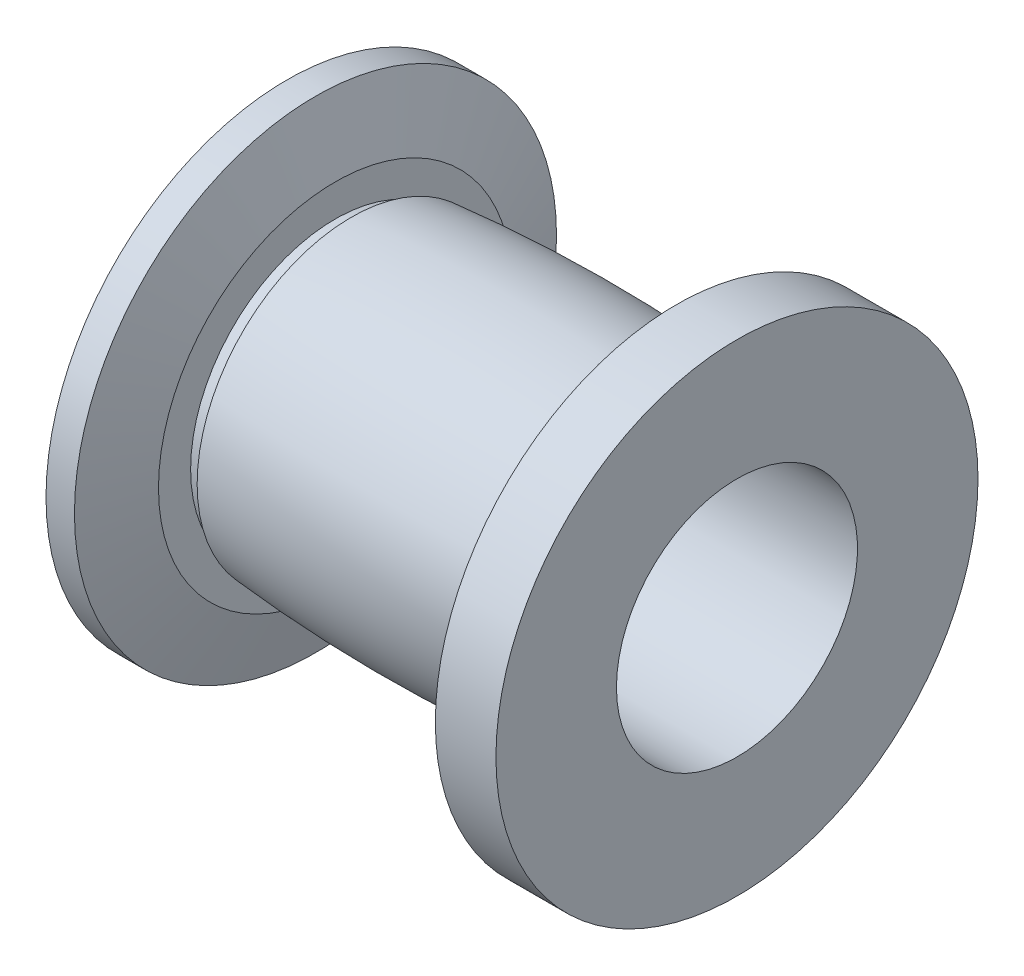
ISO-10303-21;
HEADER;
FILE_DESCRIPTION(('STEP AP214'),'2;1');
FILE_NAME('part.step','',(''),(''),'','','');
FILE_SCHEMA(('AUTOMOTIVE_DESIGN { 1 0 10303 214 1 1 1 1 }'));
ENDSEC;
DATA;
#1=APPLICATION_CONTEXT('core data for automotive mechanical design processes');
#2=APPLICATION_PROTOCOL_DEFINITION('international standard','automotive_design',2000,#1);
#3=PRODUCT_CONTEXT('',#1,'mechanical');
#4=PRODUCT('Part','Part','',(#3));
#5=PRODUCT_RELATED_PRODUCT_CATEGORY('part','',(#4));
#6=PRODUCT_DEFINITION_FORMATION('','',#4);
#7=PRODUCT_DEFINITION_CONTEXT('part definition',#1,'design');
#8=PRODUCT_DEFINITION('design','',#6,#7);
#9=PRODUCT_DEFINITION_SHAPE('','',#8);
#10=(LENGTH_UNIT() NAMED_UNIT(*) SI_UNIT(.MILLI.,.METRE.));
#11=(NAMED_UNIT(*) PLANE_ANGLE_UNIT() SI_UNIT($,.RADIAN.));
#12=(NAMED_UNIT(*) SI_UNIT($,.STERADIAN.) SOLID_ANGLE_UNIT());
#13=UNCERTAINTY_MEASURE_WITH_UNIT(LENGTH_MEASURE(1.E-05),#10,'distance_accuracy_value','');
#14=(GEOMETRIC_REPRESENTATION_CONTEXT(3) GLOBAL_UNCERTAINTY_ASSIGNED_CONTEXT((#13)) GLOBAL_UNIT_ASSIGNED_CONTEXT((#10,
#11,#12)) REPRESENTATION_CONTEXT('',''));
#15=CARTESIAN_POINT('',(0.,0.,0.));
#16=DIRECTION('',(0.,0.,1.));
#17=DIRECTION('',(1.,0.,0.));
#18=AXIS2_PLACEMENT_3D('',#15,#16,#17);
#19=CARTESIAN_POINT('',(28.,15.,0.));
#20=DIRECTION('',(-1.,0.,0.));
#21=DIRECTION('',(0.,0.,1.));
#22=AXIS2_PLACEMENT_3D('',#19,#20,#21);
#23=PLANE('',#22);
#24=CARTESIAN_POINT('',(28.,0.,0.));
#25=DIRECTION('',(-1.,0.,0.));
#26=DIRECTION('',(0.,0.,1.));
#27=AXIS2_PLACEMENT_3D('',#24,#25,#26);
#28=CIRCLE('',#27,15.);
#29=CARTESIAN_POINT('',(28.,0.,15.));
#30=VERTEX_POINT('',#29);
#31=EDGE_CURVE('E10',#30,#30,#28,.T.);
#32=ORIENTED_EDGE('',*,*,#31,.F.);
#33=EDGE_LOOP('',(#32));
#34=FACE_BOUND('',#33,.T.);
#35=CARTESIAN_POINT('',(28.,0.,0.));
#36=DIRECTION('',(-1.,0.,0.));
#37=DIRECTION('',(0.,0.,1.));
#38=AXIS2_PLACEMENT_3D('',#35,#36,#37);
#39=CIRCLE('',#38,7.5);
#40=CARTESIAN_POINT('',(28.,0.,7.5));
#41=VERTEX_POINT('',#40);
#42=EDGE_CURVE('E76',#41,#41,#39,.T.);
#43=ORIENTED_EDGE('',*,*,#42,.T.);
#44=EDGE_LOOP('',(#43));
#45=FACE_BOUND('',#44,.T.);
#46=ADVANCED_FACE('F30',(#34,#45),#23,.F.);
#47=CARTESIAN_POINT('',(0.,0.,0.));
#48=DIRECTION('',(1.,0.,0.));
#49=DIRECTION('',(0.,0.,-1.));
#50=AXIS2_PLACEMENT_3D('',#47,#48,#49);
#51=PLANE('',#50);
#52=CARTESIAN_POINT('',(0.,0.,0.));
#53=DIRECTION('',(-1.,0.,0.));
#54=DIRECTION('',(0.,0.,1.));
#55=AXIS2_PLACEMENT_3D('',#52,#53,#54);
#56=CIRCLE('',#55,15.);
#57=CARTESIAN_POINT('',(0.,0.,15.));
#58=VERTEX_POINT('',#57);
#59=EDGE_CURVE('E70',#58,#58,#56,.T.);
#60=ORIENTED_EDGE('',*,*,#59,.T.);
#61=EDGE_LOOP('',(#60));
#62=FACE_BOUND('',#61,.T.);
#63=CARTESIAN_POINT('',(0.,0.,0.));
#64=DIRECTION('',(-1.,0.,0.));
#65=DIRECTION('',(0.,0.,1.));
#66=AXIS2_PLACEMENT_3D('',#63,#64,#65);
#67=CIRCLE('',#66,7.5);
#68=CARTESIAN_POINT('',(0.,0.,7.5));
#69=VERTEX_POINT('',#68);
#70=EDGE_CURVE('E73',#69,#69,#67,.T.);
#71=ORIENTED_EDGE('',*,*,#70,.F.);
#72=EDGE_LOOP('',(#71));
#73=FACE_BOUND('',#72,.T.);
#74=ADVANCED_FACE('F94',(#62,#73),#51,.F.);
#75=CARTESIAN_POINT('',(-3.44380360226759,0.,0.));
#76=DIRECTION('',(-1.,0.,0.));
#77=DIRECTION('',(0.,0.,1.));
#78=AXIS2_PLACEMENT_3D('',#75,#76,#77);
#79=CYLINDRICAL_SURFACE('',#78,15.);
#80=CARTESIAN_POINT('',(24.23,0.,0.));
#81=DIRECTION('',(-1.,0.,0.));
#82=DIRECTION('',(0.,0.,1.));
#83=AXIS2_PLACEMENT_3D('',#80,#81,#82);
#84=CIRCLE('',#83,15.);
#85=CARTESIAN_POINT('',(24.23,0.,15.));
#86=VERTEX_POINT('',#85);
#87=EDGE_CURVE('E36',#86,#86,#84,.T.);
#88=ORIENTED_EDGE('',*,*,#87,.F.);
#89=EDGE_LOOP('',(#88));
#90=FACE_BOUND('',#89,.T.);
#91=ORIENTED_EDGE('',*,*,#31,.T.);
#92=EDGE_LOOP('',(#91));
#93=FACE_BOUND('',#92,.T.);
#94=ADVANCED_FACE('F99',(#90,#93),#79,.T.);
#95=CARTESIAN_POINT('',(24.23,0.,0.));
#96=DIRECTION('',(1.,0.,0.));
#97=DIRECTION('',(0.,0.,-1.));
#98=AXIS2_PLACEMENT_3D('',#95,#96,#97);
#99=CONICAL_SURFACE('',#98,15.,1.27247308037908);
#100=CARTESIAN_POINT('',(23.,0.,0.));
#101=DIRECTION('',(-1.,0.,0.));
#102=DIRECTION('',(0.,0.,1.));
#103=AXIS2_PLACEMENT_3D('',#100,#101,#102);
#104=CIRCLE('',#103,11.);
#105=CARTESIAN_POINT('',(23.,0.,11.));
#106=VERTEX_POINT('',#105);
#107=EDGE_CURVE('E40',#106,#106,#104,.T.);
#108=ORIENTED_EDGE('',*,*,#107,.F.);
#109=EDGE_LOOP('',(#108));
#110=FACE_BOUND('',#109,.T.);
#111=ORIENTED_EDGE('',*,*,#87,.T.);
#112=EDGE_LOOP('',(#111));
#113=FACE_BOUND('',#112,.T.);
#114=ADVANCED_FACE('F104',(#110,#113),#99,.T.);
#115=CARTESIAN_POINT('',(23.,9.,0.));
#116=DIRECTION('',(1.,0.,0.));
#117=DIRECTION('',(0.,0.,-1.));
#118=AXIS2_PLACEMENT_3D('',#115,#116,#117);
#119=PLANE('',#118);
#120=CARTESIAN_POINT('',(23.,0.,0.));
#121=DIRECTION('',(-1.,0.,0.));
#122=DIRECTION('',(0.,0.,1.));
#123=AXIS2_PLACEMENT_3D('',#120,#121,#122);
#124=CIRCLE('',#123,9.);
#125=CARTESIAN_POINT('',(23.,0.,9.));
#126=VERTEX_POINT('',#125);
#127=EDGE_CURVE('E44',#126,#126,#124,.T.);
#128=ORIENTED_EDGE('',*,*,#127,.F.);
#129=EDGE_LOOP('',(#128));
#130=FACE_BOUND('',#129,.T.);
#131=ORIENTED_EDGE('',*,*,#107,.T.);
#132=EDGE_LOOP('',(#131));
#133=FACE_BOUND('',#132,.T.);
#134=ADVANCED_FACE('F134',(#130,#133),#119,.F.);
#135=CARTESIAN_POINT('',(-3.44380360226759,0.,0.));
#136=DIRECTION('',(-1.,0.,0.));
#137=DIRECTION('',(0.,0.,1.));
#138=AXIS2_PLACEMENT_3D('',#135,#136,#137);
#139=CYLINDRICAL_SURFACE('',#138,9.);
#140=CARTESIAN_POINT('',(22.,0.,0.));
#141=DIRECTION('',(-1.,0.,0.));
#142=DIRECTION('',(0.,0.,1.));
#143=AXIS2_PLACEMENT_3D('',#140,#141,#142);
#144=CIRCLE('',#143,9.);
#145=CARTESIAN_POINT('',(22.,0.,9.));
#146=VERTEX_POINT('',#145);
#147=EDGE_CURVE('E49',#146,#146,#144,.T.);
#148=ORIENTED_EDGE('',*,*,#147,.F.);
#149=EDGE_LOOP('',(#148));
#150=FACE_BOUND('',#149,.T.);
#151=ORIENTED_EDGE('',*,*,#127,.T.);
#152=EDGE_LOOP('',(#151));
#153=FACE_BOUND('',#152,.T.);
#154=ADVANCED_FACE('F130',(#150,#153),#139,.T.);
#155=CARTESIAN_POINT('',(22.,9.5941765365827,0.));
#156=DIRECTION('',(-1.,0.,0.));
#157=DIRECTION('',(0.,0.,1.));
#158=AXIS2_PLACEMENT_3D('',#155,#156,#157);
#159=PLANE('',#158);
#160=CARTESIAN_POINT('',(22.,0.,0.));
#161=DIRECTION('',(-1.,0.,0.));
#162=DIRECTION('',(0.,0.,1.));
#163=AXIS2_PLACEMENT_3D('',#160,#161,#162);
#164=CIRCLE('',#163,9.59417653658269);
#165=CARTESIAN_POINT('',(22.,0.,9.59417653658269));
#166=VERTEX_POINT('',#165);
#167=EDGE_CURVE('E52',#166,#166,#164,.T.);
#168=ORIENTED_EDGE('',*,*,#167,.F.);
#169=EDGE_LOOP('',(#168));
#170=FACE_BOUND('',#169,.T.);
#171=ORIENTED_EDGE('',*,*,#147,.T.);
#172=EDGE_LOOP('',(#171));
#173=FACE_BOUND('',#172,.T.);
#174=ADVANCED_FACE('F126',(#170,#173),#159,.F.);
#175=CARTESIAN_POINT('',(13.,0.,0.));
#176=DIRECTION('',(-1.,0.,0.));
#177=DIRECTION('',(0.,0.,1.));
#178=AXIS2_PLACEMENT_3D('',#175,#176,#177);
#179=DEGENERATE_TOROIDAL_SURFACE('',#178,90.,100.,.F.);
#180=CARTESIAN_POINT('',(4.,0.,0.));
#181=DIRECTION('',(-1.,0.,0.));
#182=DIRECTION('',(0.,0.,1.));
#183=AXIS2_PLACEMENT_3D('',#180,#181,#182);
#184=CIRCLE('',#183,9.5941765365827);
#185=CARTESIAN_POINT('',(4.,0.,9.5941765365827));
#186=VERTEX_POINT('',#185);
#187=EDGE_CURVE('E55',#186,#186,#184,.T.);
#188=ORIENTED_EDGE('',*,*,#187,.F.);
#189=EDGE_LOOP('',(#188));
#190=FACE_BOUND('',#189,.T.);
#191=ORIENTED_EDGE('',*,*,#167,.T.);
#192=EDGE_LOOP('',(#191));
#193=FACE_BOUND('',#192,.T.);
#194=ADVANCED_FACE('F122',(#190,#193),#179,.F.);
#195=CARTESIAN_POINT('',(4.,9.,0.));
#196=DIRECTION('',(1.,0.,0.));
#197=DIRECTION('',(0.,0.,-1.));
#198=AXIS2_PLACEMENT_3D('',#195,#196,#197);
#199=PLANE('',#198);
#200=CARTESIAN_POINT('',(4.,0.,0.));
#201=DIRECTION('',(-1.,0.,0.));
#202=DIRECTION('',(0.,0.,1.));
#203=AXIS2_PLACEMENT_3D('',#200,#201,#202);
#204=CIRCLE('',#203,9.);
#205=CARTESIAN_POINT('',(4.,0.,9.));
#206=VERTEX_POINT('',#205);
#207=EDGE_CURVE('E58',#206,#206,#204,.T.);
#208=ORIENTED_EDGE('',*,*,#207,.F.);
#209=EDGE_LOOP('',(#208));
#210=FACE_BOUND('',#209,.T.);
#211=ORIENTED_EDGE('',*,*,#187,.T.);
#212=EDGE_LOOP('',(#211));
#213=FACE_BOUND('',#212,.T.);
#214=ADVANCED_FACE('F118',(#210,#213),#199,.F.);
#215=CARTESIAN_POINT('',(-3.44380360226759,0.,0.));
#216=DIRECTION('',(-1.,0.,0.));
#217=DIRECTION('',(0.,0.,1.));
#218=AXIS2_PLACEMENT_3D('',#215,#216,#217);
#219=CYLINDRICAL_SURFACE('',#218,9.);
#220=CARTESIAN_POINT('',(3.,0.,0.));
#221=DIRECTION('',(-1.,0.,0.));
#222=DIRECTION('',(0.,0.,1.));
#223=AXIS2_PLACEMENT_3D('',#220,#221,#222);
#224=CIRCLE('',#223,9.);
#225=CARTESIAN_POINT('',(3.,0.,9.));
#226=VERTEX_POINT('',#225);
#227=EDGE_CURVE('E61',#226,#226,#224,.T.);
#228=ORIENTED_EDGE('',*,*,#227,.F.);
#229=EDGE_LOOP('',(#228));
#230=FACE_BOUND('',#229,.T.);
#231=ORIENTED_EDGE('',*,*,#207,.T.);
#232=EDGE_LOOP('',(#231));
#233=FACE_BOUND('',#232,.T.);
#234=ADVANCED_FACE('F114',(#230,#233),#219,.T.);
#235=CARTESIAN_POINT('',(3.,11.,0.));
#236=DIRECTION('',(-1.,0.,0.));
#237=DIRECTION('',(0.,0.,1.));
#238=AXIS2_PLACEMENT_3D('',#235,#236,#237);
#239=PLANE('',#238);
#240=CARTESIAN_POINT('',(3.,0.,0.));
#241=DIRECTION('',(-1.,0.,0.));
#242=DIRECTION('',(0.,0.,1.));
#243=AXIS2_PLACEMENT_3D('',#240,#241,#242);
#244=CIRCLE('',#243,11.);
#245=CARTESIAN_POINT('',(3.,0.,11.));
#246=VERTEX_POINT('',#245);
#247=EDGE_CURVE('E64',#246,#246,#244,.T.);
#248=ORIENTED_EDGE('',*,*,#247,.F.);
#249=EDGE_LOOP('',(#248));
#250=FACE_BOUND('',#249,.T.);
#251=ORIENTED_EDGE('',*,*,#227,.T.);
#252=EDGE_LOOP('',(#251));
#253=FACE_BOUND('',#252,.T.);
#254=ADVANCED_FACE('F110',(#250,#253),#239,.F.);
#255=CARTESIAN_POINT('',(3.,0.,0.));
#256=DIRECTION('',(-1.,0.,0.));
#257=DIRECTION('',(0.,0.,1.));
#258=AXIS2_PLACEMENT_3D('',#255,#256,#257);
#259=CONICAL_SURFACE('',#258,11.,1.27247308037908);
#260=CARTESIAN_POINT('',(1.77,0.,0.));
#261=DIRECTION('',(-1.,0.,0.));
#262=DIRECTION('',(0.,0.,1.));
#263=AXIS2_PLACEMENT_3D('',#260,#261,#262);
#264=CIRCLE('',#263,15.);
#265=CARTESIAN_POINT('',(1.77,0.,15.));
#266=VERTEX_POINT('',#265);
#267=EDGE_CURVE('E67',#266,#266,#264,.T.);
#268=ORIENTED_EDGE('',*,*,#267,.F.);
#269=EDGE_LOOP('',(#268));
#270=FACE_BOUND('',#269,.T.);
#271=ORIENTED_EDGE('',*,*,#247,.T.);
#272=EDGE_LOOP('',(#271));
#273=FACE_BOUND('',#272,.T.);
#274=ADVANCED_FACE('F89',(#270,#273),#259,.T.);
#275=CARTESIAN_POINT('',(-3.44380360226759,0.,0.));
#276=DIRECTION('',(-1.,0.,0.));
#277=DIRECTION('',(0.,0.,1.));
#278=AXIS2_PLACEMENT_3D('',#275,#276,#277);
#279=CYLINDRICAL_SURFACE('',#278,15.);
#280=ORIENTED_EDGE('',*,*,#59,.F.);
#281=EDGE_LOOP('',(#280));
#282=FACE_BOUND('',#281,.T.);
#283=ORIENTED_EDGE('',*,*,#267,.T.);
#284=EDGE_LOOP('',(#283));
#285=FACE_BOUND('',#284,.T.);
#286=ADVANCED_FACE('F83',(#282,#285),#279,.T.);
#287=CARTESIAN_POINT('',(-3.38378378378378,0.,0.));
#288=DIRECTION('',(-1.,0.,0.));
#289=DIRECTION('',(0.,0.,1.));
#290=AXIS2_PLACEMENT_3D('',#287,#288,#289);
#291=CYLINDRICAL_SURFACE('',#290,7.5);
#292=ORIENTED_EDGE('',*,*,#70,.T.);
#293=EDGE_LOOP('',(#292));
#294=FACE_BOUND('',#293,.T.);
#295=ORIENTED_EDGE('',*,*,#42,.F.);
#296=EDGE_LOOP('',(#295));
#297=FACE_BOUND('',#296,.T.);
#298=ADVANCED_FACE('F81',(#294,#297),#291,.F.);
#299=CLOSED_SHELL('',(#46,#74,#94,#114,#134,#154,#174,#194,#214,#234,#254,#274,#286,#298));
#300=MANIFOLD_SOLID_BREP('B2',#299);
#301=ADVANCED_BREP_SHAPE_REPRESENTATION('',(#18,#300),#14);
#302=SHAPE_DEFINITION_REPRESENTATION(#9,#301);
ENDSEC;
END-ISO-10303-21;
